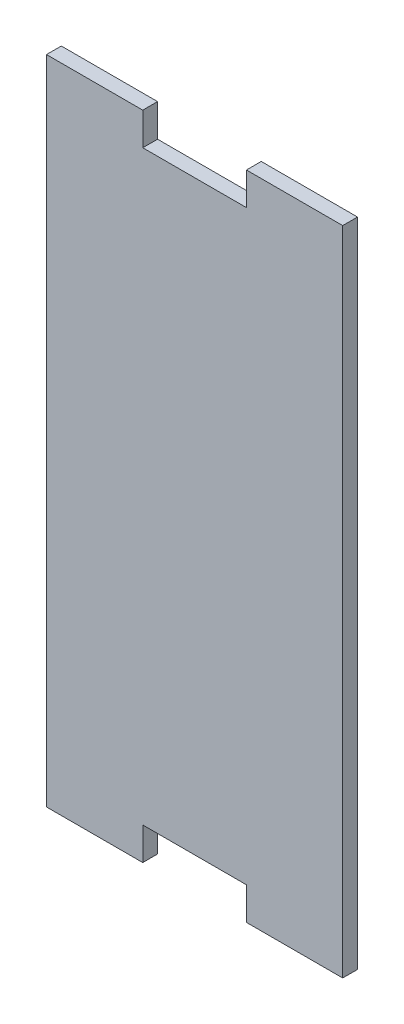
ISO-10303-21;
HEADER;
FILE_DESCRIPTION(('STEP AP214'),'2;1');
FILE_NAME('part.step','',(''),(''),'','','');
FILE_SCHEMA(('AUTOMOTIVE_DESIGN { 1 0 10303 214 1 1 1 1 }'));
ENDSEC;
DATA;
#1=APPLICATION_CONTEXT('core data for automotive mechanical design processes');
#2=APPLICATION_PROTOCOL_DEFINITION('international standard','automotive_design',2000,#1);
#3=PRODUCT_CONTEXT('',#1,'mechanical');
#4=PRODUCT('Part','Part','',(#3));
#5=PRODUCT_RELATED_PRODUCT_CATEGORY('part','',(#4));
#6=PRODUCT_DEFINITION_FORMATION('','',#4);
#7=PRODUCT_DEFINITION_CONTEXT('part definition',#1,'design');
#8=PRODUCT_DEFINITION('design','',#6,#7);
#9=PRODUCT_DEFINITION_SHAPE('','',#8);
#10=(LENGTH_UNIT() NAMED_UNIT(*) SI_UNIT(.MILLI.,.METRE.));
#11=(NAMED_UNIT(*) PLANE_ANGLE_UNIT() SI_UNIT($,.RADIAN.));
#12=(NAMED_UNIT(*) SI_UNIT($,.STERADIAN.) SOLID_ANGLE_UNIT());
#13=UNCERTAINTY_MEASURE_WITH_UNIT(LENGTH_MEASURE(1.E-05),#10,'distance_accuracy_value','');
#14=(GEOMETRIC_REPRESENTATION_CONTEXT(3) GLOBAL_UNCERTAINTY_ASSIGNED_CONTEXT((#13)) GLOBAL_UNIT_ASSIGNED_CONTEXT((#10,
#11,#12)) REPRESENTATION_CONTEXT('',''));
#15=CARTESIAN_POINT('',(0.,0.,0.));
#16=DIRECTION('',(0.,0.,1.));
#17=DIRECTION('',(1.,0.,0.));
#18=AXIS2_PLACEMENT_3D('',#15,#16,#17);
#19=CARTESIAN_POINT('',(-5.,-11.,0.5));
#20=DIRECTION('',(0.,1.,0.));
#21=DIRECTION('',(0.,0.,1.));
#22=AXIS2_PLACEMENT_3D('',#19,#20,#21);
#23=PLANE('',#22);
#24=DIRECTION('',(0.,0.,1.));
#25=VECTOR('',#24,1.);
#26=CARTESIAN_POINT('',(-1.75,-11.,0.));
#27=LINE('',#26,#25);
#28=CARTESIAN_POINT('',(-1.75,-11.,0.));
#29=VERTEX_POINT('',#28);
#30=CARTESIAN_POINT('',(-1.75,-11.,0.5));
#31=VERTEX_POINT('',#30);
#32=EDGE_CURVE('E121',#29,#31,#27,.T.);
#33=ORIENTED_EDGE('',*,*,#32,.T.);
#34=DIRECTION('',(1.,0.,0.));
#35=VECTOR('',#34,1.);
#36=CARTESIAN_POINT('',(-5.,-11.,0.5));
#37=LINE('',#36,#35);
#38=CARTESIAN_POINT('',(-5.,-11.,0.5));
#39=VERTEX_POINT('',#38);
#40=EDGE_CURVE('E162',#39,#31,#37,.T.);
#41=ORIENTED_EDGE('',*,*,#40,.F.);
#42=DIRECTION('',(0.,0.,-1.));
#43=VECTOR('',#42,1.);
#44=CARTESIAN_POINT('',(-5.,-11.,0.5));
#45=LINE('',#44,#43);
#46=CARTESIAN_POINT('',(-5.,-11.,0.));
#47=VERTEX_POINT('',#46);
#48=EDGE_CURVE('E148',#39,#47,#45,.T.);
#49=ORIENTED_EDGE('',*,*,#48,.T.);
#50=DIRECTION('',(1.,0.,0.));
#51=VECTOR('',#50,1.);
#52=CARTESIAN_POINT('',(-5.,-11.,0.));
#53=LINE('',#52,#51);
#54=EDGE_CURVE('E141',#47,#29,#53,.T.);
#55=ORIENTED_EDGE('',*,*,#54,.T.);
#56=EDGE_LOOP('',(#33,#41,#49,#55));
#57=FACE_BOUND('',#56,.T.);
#58=ADVANCED_FACE('F33',(#57),#23,.F.);
#59=DIRECTION('',(0.,0.,1.));
#60=VECTOR('',#59,1.);
#61=CARTESIAN_POINT('',(1.75,-11.,0.));
#62=LINE('',#61,#60);
#63=CARTESIAN_POINT('',(1.75,-11.,0.));
#64=VERTEX_POINT('',#63);
#65=CARTESIAN_POINT('',(1.75,-11.,0.5));
#66=VERTEX_POINT('',#65);
#67=EDGE_CURVE('E133',#64,#66,#62,.T.);
#68=ORIENTED_EDGE('',*,*,#67,.F.);
#69=CARTESIAN_POINT('',(5.,-11.,0.));
#70=VERTEX_POINT('',#69);
#71=EDGE_CURVE('E150',#64,#70,#53,.T.);
#72=ORIENTED_EDGE('',*,*,#71,.T.);
#73=DIRECTION('',(0.,0.,-1.));
#74=VECTOR('',#73,1.);
#75=CARTESIAN_POINT('',(5.,-11.,0.5));
#76=LINE('',#75,#74);
#77=CARTESIAN_POINT('',(5.,-11.,0.5));
#78=VERTEX_POINT('',#77);
#79=EDGE_CURVE('E159',#78,#70,#76,.T.);
#80=ORIENTED_EDGE('',*,*,#79,.F.);
#81=EDGE_CURVE('E184',#66,#78,#37,.T.);
#82=ORIENTED_EDGE('',*,*,#81,.F.);
#83=EDGE_LOOP('',(#68,#72,#80,#82));
#84=FACE_BOUND('',#83,.T.);
#85=ADVANCED_FACE('F226',(#84),#23,.F.);
#86=CARTESIAN_POINT('',(0.,0.,0.5));
#87=DIRECTION('',(0.,0.,-1.));
#88=DIRECTION('',(-1.,0.,0.));
#89=AXIS2_PLACEMENT_3D('',#86,#87,#88);
#90=PLANE('',#89);
#91=DIRECTION('',(0.,1.,0.));
#92=VECTOR('',#91,1.);
#93=CARTESIAN_POINT('',(-1.75,-11.,0.5));
#94=LINE('',#93,#92);
#95=CARTESIAN_POINT('',(-1.75,-9.9,0.5));
#96=VERTEX_POINT('',#95);
#97=EDGE_CURVE('E128',#31,#96,#94,.T.);
#98=ORIENTED_EDGE('',*,*,#97,.T.);
#99=DIRECTION('',(1.,0.,0.));
#100=VECTOR('',#99,1.);
#101=CARTESIAN_POINT('',(-1.75,-9.9,0.5));
#102=LINE('',#101,#100);
#103=CARTESIAN_POINT('',(1.75,-9.9,0.5));
#104=VERTEX_POINT('',#103);
#105=EDGE_CURVE('E144',#96,#104,#102,.T.);
#106=ORIENTED_EDGE('',*,*,#105,.T.);
#107=DIRECTION('',(0.,-1.,0.));
#108=VECTOR('',#107,1.);
#109=CARTESIAN_POINT('',(1.75,-11.,0.5));
#110=LINE('',#109,#108);
#111=EDGE_CURVE('E216',#104,#66,#110,.T.);
#112=ORIENTED_EDGE('',*,*,#111,.T.);
#113=ORIENTED_EDGE('',*,*,#81,.T.);
#114=DIRECTION('',(0.,1.,0.));
#115=VECTOR('',#114,1.);
#116=CARTESIAN_POINT('',(5.,-11.,0.5));
#117=LINE('',#116,#115);
#118=CARTESIAN_POINT('',(5.,11.,0.5));
#119=VERTEX_POINT('',#118);
#120=EDGE_CURVE('E149',#78,#119,#117,.T.);
#121=ORIENTED_EDGE('',*,*,#120,.T.);
#122=DIRECTION('',(-1.,0.,0.));
#123=VECTOR('',#122,1.);
#124=CARTESIAN_POINT('',(-5.,11.,0.5));
#125=LINE('',#124,#123);
#126=CARTESIAN_POINT('',(1.75,11.,0.5));
#127=VERTEX_POINT('',#126);
#128=EDGE_CURVE('E186',#119,#127,#125,.T.);
#129=ORIENTED_EDGE('',*,*,#128,.T.);
#130=DIRECTION('',(0.,1.,0.));
#131=VECTOR('',#130,1.);
#132=CARTESIAN_POINT('',(1.75,11.,0.5));
#133=LINE('',#132,#131);
#134=CARTESIAN_POINT('',(1.75,9.9,0.5));
#135=VERTEX_POINT('',#134);
#136=EDGE_CURVE('E196',#135,#127,#133,.T.);
#137=ORIENTED_EDGE('',*,*,#136,.F.);
#138=DIRECTION('',(1.,0.,0.));
#139=VECTOR('',#138,1.);
#140=CARTESIAN_POINT('',(-1.75,9.9,0.5));
#141=LINE('',#140,#139);
#142=CARTESIAN_POINT('',(-1.75,9.9,0.5));
#143=VERTEX_POINT('',#142);
#144=EDGE_CURVE('E199',#143,#135,#141,.T.);
#145=ORIENTED_EDGE('',*,*,#144,.F.);
#146=DIRECTION('',(0.,-1.,0.));
#147=VECTOR('',#146,1.);
#148=CARTESIAN_POINT('',(-1.75,11.,0.5));
#149=LINE('',#148,#147);
#150=CARTESIAN_POINT('',(-1.75,11.,0.5));
#151=VERTEX_POINT('',#150);
#152=EDGE_CURVE('E202',#151,#143,#149,.T.);
#153=ORIENTED_EDGE('',*,*,#152,.F.);
#154=CARTESIAN_POINT('',(-5.,11.,0.5));
#155=VERTEX_POINT('',#154);
#156=EDGE_CURVE('E153',#151,#155,#125,.T.);
#157=ORIENTED_EDGE('',*,*,#156,.T.);
#158=DIRECTION('',(0.,-1.,0.));
#159=VECTOR('',#158,1.);
#160=CARTESIAN_POINT('',(-5.,-11.,0.5));
#161=LINE('',#160,#159);
#162=EDGE_CURVE('E168',#155,#39,#161,.T.);
#163=ORIENTED_EDGE('',*,*,#162,.T.);
#164=ORIENTED_EDGE('',*,*,#40,.T.);
#165=EDGE_LOOP('',(#98,#106,#112,#113,#121,#129,#137,#145,#153,#157,#163,#164));
#166=FACE_BOUND('',#165,.T.);
#167=ADVANCED_FACE('F233',(#166),#90,.F.);
#168=CARTESIAN_POINT('',(0.,0.,0.));
#169=DIRECTION('',(0.,0.,-1.));
#170=DIRECTION('',(-1.,0.,0.));
#171=AXIS2_PLACEMENT_3D('',#168,#169,#170);
#172=PLANE('',#171);
#173=DIRECTION('',(1.,0.,0.));
#174=VECTOR('',#173,1.);
#175=CARTESIAN_POINT('',(-1.75,-9.9,0.));
#176=LINE('',#175,#174);
#177=CARTESIAN_POINT('',(-1.75,-9.9,0.));
#178=VERTEX_POINT('',#177);
#179=CARTESIAN_POINT('',(1.75,-9.9,0.));
#180=VERTEX_POINT('',#179);
#181=EDGE_CURVE('E134',#178,#180,#176,.T.);
#182=ORIENTED_EDGE('',*,*,#181,.F.);
#183=DIRECTION('',(0.,1.,0.));
#184=VECTOR('',#183,1.);
#185=CARTESIAN_POINT('',(-1.75,-11.,0.));
#186=LINE('',#185,#184);
#187=EDGE_CURVE('E125',#29,#178,#186,.T.);
#188=ORIENTED_EDGE('',*,*,#187,.F.);
#189=ORIENTED_EDGE('',*,*,#54,.F.);
#190=DIRECTION('',(0.,-1.,0.));
#191=VECTOR('',#190,1.);
#192=CARTESIAN_POINT('',(-5.,-11.,0.));
#193=LINE('',#192,#191);
#194=CARTESIAN_POINT('',(-5.,11.,0.));
#195=VERTEX_POINT('',#194);
#196=EDGE_CURVE('E155',#195,#47,#193,.T.);
#197=ORIENTED_EDGE('',*,*,#196,.F.);
#198=DIRECTION('',(-1.,0.,0.));
#199=VECTOR('',#198,1.);
#200=CARTESIAN_POINT('',(-5.,11.,0.));
#201=LINE('',#200,#199);
#202=CARTESIAN_POINT('',(-1.75,11.,0.));
#203=VERTEX_POINT('',#202);
#204=EDGE_CURVE('E173',#203,#195,#201,.T.);
#205=ORIENTED_EDGE('',*,*,#204,.F.);
#206=DIRECTION('',(0.,-1.,0.));
#207=VECTOR('',#206,1.);
#208=CARTESIAN_POINT('',(-1.75,11.,0.));
#209=LINE('',#208,#207);
#210=CARTESIAN_POINT('',(-1.75,9.9,0.));
#211=VERTEX_POINT('',#210);
#212=EDGE_CURVE('E198',#203,#211,#209,.T.);
#213=ORIENTED_EDGE('',*,*,#212,.T.);
#214=DIRECTION('',(1.,0.,0.));
#215=VECTOR('',#214,1.);
#216=CARTESIAN_POINT('',(-1.75,9.9,0.));
#217=LINE('',#216,#215);
#218=CARTESIAN_POINT('',(1.75,9.9,0.));
#219=VERTEX_POINT('',#218);
#220=EDGE_CURVE('E207',#211,#219,#217,.T.);
#221=ORIENTED_EDGE('',*,*,#220,.T.);
#222=DIRECTION('',(0.,1.,0.));
#223=VECTOR('',#222,1.);
#224=CARTESIAN_POINT('',(1.75,11.,0.));
#225=LINE('',#224,#223);
#226=CARTESIAN_POINT('',(1.75,11.,0.));
#227=VERTEX_POINT('',#226);
#228=EDGE_CURVE('E56',#219,#227,#225,.T.);
#229=ORIENTED_EDGE('',*,*,#228,.T.);
#230=CARTESIAN_POINT('',(5.,11.,0.));
#231=VERTEX_POINT('',#230);
#232=EDGE_CURVE('E174',#231,#227,#201,.T.);
#233=ORIENTED_EDGE('',*,*,#232,.F.);
#234=DIRECTION('',(0.,1.,0.));
#235=VECTOR('',#234,1.);
#236=CARTESIAN_POINT('',(5.,-11.,0.));
#237=LINE('',#236,#235);
#238=EDGE_CURVE('E178',#70,#231,#237,.T.);
#239=ORIENTED_EDGE('',*,*,#238,.F.);
#240=ORIENTED_EDGE('',*,*,#71,.F.);
#241=DIRECTION('',(0.,-1.,0.));
#242=VECTOR('',#241,1.);
#243=CARTESIAN_POINT('',(1.75,-11.,0.));
#244=LINE('',#243,#242);
#245=EDGE_CURVE('E143',#180,#64,#244,.T.);
#246=ORIENTED_EDGE('',*,*,#245,.F.);
#247=EDGE_LOOP('',(#182,#188,#189,#197,#205,#213,#221,#229,#233,#239,#240,#246));
#248=FACE_BOUND('',#247,.T.);
#249=ADVANCED_FACE('F139',(#248),#172,.T.);
#250=CARTESIAN_POINT('',(-5.,11.,0.5));
#251=DIRECTION('',(0.,-1.,0.));
#252=DIRECTION('',(0.,0.,-1.));
#253=AXIS2_PLACEMENT_3D('',#250,#251,#252);
#254=PLANE('',#253);
#255=ORIENTED_EDGE('',*,*,#156,.F.);
#256=DIRECTION('',(0.,0.,1.));
#257=VECTOR('',#256,1.);
#258=CARTESIAN_POINT('',(-1.75,11.,0.));
#259=LINE('',#258,#257);
#260=EDGE_CURVE('E182',#203,#151,#259,.T.);
#261=ORIENTED_EDGE('',*,*,#260,.F.);
#262=ORIENTED_EDGE('',*,*,#204,.T.);
#263=DIRECTION('',(0.,0.,-1.));
#264=VECTOR('',#263,1.);
#265=CARTESIAN_POINT('',(-5.,11.,0.5));
#266=LINE('',#265,#264);
#267=EDGE_CURVE('E41',#155,#195,#266,.T.);
#268=ORIENTED_EDGE('',*,*,#267,.F.);
#269=EDGE_LOOP('',(#255,#261,#262,#268));
#270=FACE_BOUND('',#269,.T.);
#271=ADVANCED_FACE('F258',(#270),#254,.F.);
#272=CARTESIAN_POINT('',(5.,-11.,0.5));
#273=DIRECTION('',(-1.,0.,0.));
#274=DIRECTION('',(0.,0.,1.));
#275=AXIS2_PLACEMENT_3D('',#272,#273,#274);
#276=PLANE('',#275);
#277=ORIENTED_EDGE('',*,*,#238,.T.);
#278=DIRECTION('',(0.,0.,-1.));
#279=VECTOR('',#278,1.);
#280=CARTESIAN_POINT('',(5.,11.,0.5));
#281=LINE('',#280,#279);
#282=EDGE_CURVE('E11',#119,#231,#281,.T.);
#283=ORIENTED_EDGE('',*,*,#282,.F.);
#284=ORIENTED_EDGE('',*,*,#120,.F.);
#285=ORIENTED_EDGE('',*,*,#79,.T.);
#286=EDGE_LOOP('',(#277,#283,#284,#285));
#287=FACE_BOUND('',#286,.T.);
#288=ADVANCED_FACE('F35',(#287),#276,.F.);
#289=ORIENTED_EDGE('',*,*,#232,.T.);
#290=DIRECTION('',(0.,0.,1.));
#291=VECTOR('',#290,1.);
#292=CARTESIAN_POINT('',(1.75,11.,0.));
#293=LINE('',#292,#291);
#294=EDGE_CURVE('E193',#227,#127,#293,.T.);
#295=ORIENTED_EDGE('',*,*,#294,.T.);
#296=ORIENTED_EDGE('',*,*,#128,.F.);
#297=ORIENTED_EDGE('',*,*,#282,.T.);
#298=EDGE_LOOP('',(#289,#295,#296,#297));
#299=FACE_BOUND('',#298,.T.);
#300=ADVANCED_FACE('F256',(#299),#254,.F.);
#301=CARTESIAN_POINT('',(-5.,-11.,0.5));
#302=DIRECTION('',(1.,0.,0.));
#303=DIRECTION('',(0.,0.,-1.));
#304=AXIS2_PLACEMENT_3D('',#301,#302,#303);
#305=PLANE('',#304);
#306=ORIENTED_EDGE('',*,*,#196,.T.);
#307=ORIENTED_EDGE('',*,*,#48,.F.);
#308=ORIENTED_EDGE('',*,*,#162,.F.);
#309=ORIENTED_EDGE('',*,*,#267,.T.);
#310=EDGE_LOOP('',(#306,#307,#308,#309));
#311=FACE_BOUND('',#310,.T.);
#312=ADVANCED_FACE('F167',(#311),#305,.F.);
#313=CARTESIAN_POINT('',(-1.75,11.,0.));
#314=DIRECTION('',(-1.,0.,0.));
#315=DIRECTION('',(0.,-1.,0.));
#316=AXIS2_PLACEMENT_3D('',#313,#314,#315);
#317=PLANE('',#316);
#318=ORIENTED_EDGE('',*,*,#152,.T.);
#319=DIRECTION('',(0.,0.,1.));
#320=VECTOR('',#319,1.);
#321=CARTESIAN_POINT('',(-1.75,9.9,0.));
#322=LINE('',#321,#320);
#323=EDGE_CURVE('E189',#211,#143,#322,.T.);
#324=ORIENTED_EDGE('',*,*,#323,.F.);
#325=ORIENTED_EDGE('',*,*,#212,.F.);
#326=ORIENTED_EDGE('',*,*,#260,.T.);
#327=EDGE_LOOP('',(#318,#324,#325,#326));
#328=FACE_BOUND('',#327,.T.);
#329=ADVANCED_FACE('F255',(#328),#317,.F.);
#330=CARTESIAN_POINT('',(1.75,11.,0.));
#331=DIRECTION('',(1.,0.,0.));
#332=DIRECTION('',(0.,0.,-1.));
#333=AXIS2_PLACEMENT_3D('',#330,#331,#332);
#334=PLANE('',#333);
#335=ORIENTED_EDGE('',*,*,#136,.T.);
#336=ORIENTED_EDGE('',*,*,#294,.F.);
#337=ORIENTED_EDGE('',*,*,#228,.F.);
#338=DIRECTION('',(0.,0.,1.));
#339=VECTOR('',#338,1.);
#340=CARTESIAN_POINT('',(1.75,9.9,0.));
#341=LINE('',#340,#339);
#342=EDGE_CURVE('E191',#219,#135,#341,.T.);
#343=ORIENTED_EDGE('',*,*,#342,.T.);
#344=EDGE_LOOP('',(#335,#336,#337,#343));
#345=FACE_BOUND('',#344,.T.);
#346=ADVANCED_FACE('F272',(#345),#334,.F.);
#347=CARTESIAN_POINT('',(-1.75,9.9,0.));
#348=DIRECTION('',(0.,-1.,0.));
#349=DIRECTION('',(0.,0.,-1.));
#350=AXIS2_PLACEMENT_3D('',#347,#348,#349);
#351=PLANE('',#350);
#352=ORIENTED_EDGE('',*,*,#144,.T.);
#353=ORIENTED_EDGE('',*,*,#342,.F.);
#354=ORIENTED_EDGE('',*,*,#220,.F.);
#355=ORIENTED_EDGE('',*,*,#323,.T.);
#356=EDGE_LOOP('',(#352,#353,#354,#355));
#357=FACE_BOUND('',#356,.T.);
#358=ADVANCED_FACE('F244',(#357),#351,.F.);
#359=CARTESIAN_POINT('',(-1.75,-11.,0.));
#360=DIRECTION('',(1.,0.,0.));
#361=DIRECTION('',(0.,1.,0.));
#362=AXIS2_PLACEMENT_3D('',#359,#360,#361);
#363=PLANE('',#362);
#364=ORIENTED_EDGE('',*,*,#97,.F.);
#365=ORIENTED_EDGE('',*,*,#32,.F.);
#366=ORIENTED_EDGE('',*,*,#187,.T.);
#367=DIRECTION('',(0.,0.,1.));
#368=VECTOR('',#367,1.);
#369=CARTESIAN_POINT('',(-1.75,-9.9,0.));
#370=LINE('',#369,#368);
#371=EDGE_CURVE('E205',#178,#96,#370,.T.);
#372=ORIENTED_EDGE('',*,*,#371,.T.);
#373=EDGE_LOOP('',(#364,#365,#366,#372));
#374=FACE_BOUND('',#373,.T.);
#375=ADVANCED_FACE('F123',(#374),#363,.T.);
#376=CARTESIAN_POINT('',(-1.75,-9.9,0.));
#377=DIRECTION('',(0.,-1.,0.));
#378=DIRECTION('',(0.,0.,-1.));
#379=AXIS2_PLACEMENT_3D('',#376,#377,#378);
#380=PLANE('',#379);
#381=ORIENTED_EDGE('',*,*,#105,.F.);
#382=ORIENTED_EDGE('',*,*,#371,.F.);
#383=ORIENTED_EDGE('',*,*,#181,.T.);
#384=DIRECTION('',(0.,0.,1.));
#385=VECTOR('',#384,1.);
#386=CARTESIAN_POINT('',(1.75,-9.9,0.));
#387=LINE('',#386,#385);
#388=EDGE_CURVE('E48',#180,#104,#387,.T.);
#389=ORIENTED_EDGE('',*,*,#388,.T.);
#390=EDGE_LOOP('',(#381,#382,#383,#389));
#391=FACE_BOUND('',#390,.T.);
#392=ADVANCED_FACE('F236',(#391),#380,.T.);
#393=CARTESIAN_POINT('',(1.75,-11.,0.));
#394=DIRECTION('',(-1.,0.,0.));
#395=DIRECTION('',(0.,0.,1.));
#396=AXIS2_PLACEMENT_3D('',#393,#394,#395);
#397=PLANE('',#396);
#398=ORIENTED_EDGE('',*,*,#111,.F.);
#399=ORIENTED_EDGE('',*,*,#388,.F.);
#400=ORIENTED_EDGE('',*,*,#245,.T.);
#401=ORIENTED_EDGE('',*,*,#67,.T.);
#402=EDGE_LOOP('',(#398,#399,#400,#401));
#403=FACE_BOUND('',#402,.T.);
#404=ADVANCED_FACE('F222',(#403),#397,.T.);
#405=CLOSED_SHELL('',(#58,#85,#167,#249,#271,#288,#300,#312,#329,#346,#358,#375,#392,#404));
#406=MANIFOLD_SOLID_BREP('B2',#405);
#407=ADVANCED_BREP_SHAPE_REPRESENTATION('',(#18,#406),#14);
#408=SHAPE_DEFINITION_REPRESENTATION(#9,#407);
ENDSEC;
END-ISO-10303-21;
